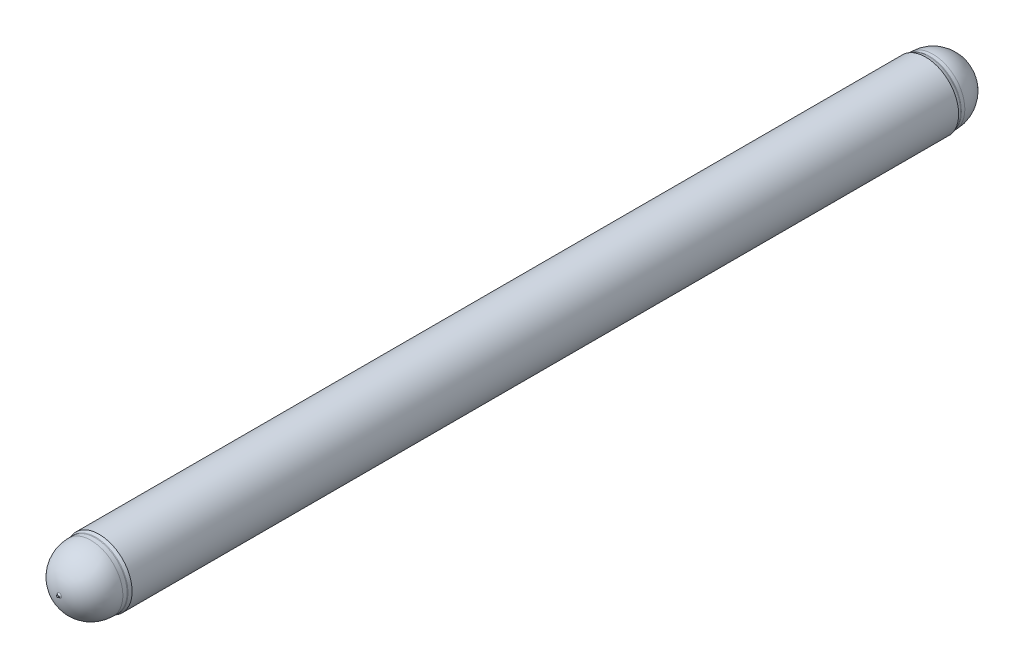
ISO-10303-21;
HEADER;
FILE_DESCRIPTION(('STEP AP214'),'2;1');
FILE_NAME('part.step','',(''),(''),'','','');
FILE_SCHEMA(('AUTOMOTIVE_DESIGN { 1 0 10303 214 1 1 1 1 }'));
ENDSEC;
DATA;
#1=APPLICATION_CONTEXT('core data for automotive mechanical design processes');
#2=APPLICATION_PROTOCOL_DEFINITION('international standard','automotive_design',2000,#1);
#3=PRODUCT_CONTEXT('',#1,'mechanical');
#4=PRODUCT('Part','Part','',(#3));
#5=PRODUCT_RELATED_PRODUCT_CATEGORY('part','',(#4));
#6=PRODUCT_DEFINITION_FORMATION('','',#4);
#7=PRODUCT_DEFINITION_CONTEXT('part definition',#1,'design');
#8=PRODUCT_DEFINITION('design','',#6,#7);
#9=PRODUCT_DEFINITION_SHAPE('','',#8);
#10=(LENGTH_UNIT() NAMED_UNIT(*) SI_UNIT(.MILLI.,.METRE.));
#11=(NAMED_UNIT(*) PLANE_ANGLE_UNIT() SI_UNIT($,.RADIAN.));
#12=(NAMED_UNIT(*) SI_UNIT($,.STERADIAN.) SOLID_ANGLE_UNIT());
#13=UNCERTAINTY_MEASURE_WITH_UNIT(LENGTH_MEASURE(1.E-05),#10,'distance_accuracy_value','');
#14=(GEOMETRIC_REPRESENTATION_CONTEXT(3) GLOBAL_UNCERTAINTY_ASSIGNED_CONTEXT((#13)) GLOBAL_UNIT_ASSIGNED_CONTEXT((#10,
#11,#12)) REPRESENTATION_CONTEXT('',''));
#15=CARTESIAN_POINT('',(0.,0.,0.));
#16=DIRECTION('',(0.,0.,1.));
#17=DIRECTION('',(1.,0.,0.));
#18=AXIS2_PLACEMENT_3D('',#15,#16,#17);
#19=CARTESIAN_POINT('',(0.,0.,0.));
#20=DIRECTION('',(0.,0.,1.));
#21=DIRECTION('',(1.,0.,0.));
#22=AXIS2_PLACEMENT_3D('',#19,#20,#21);
#23=PLANE('',#22);
#24=CARTESIAN_POINT('',(0.,0.,0.));
#25=DIRECTION('',(0.,0.,1.));
#26=DIRECTION('',(1.,0.,0.));
#27=AXIS2_PLACEMENT_3D('',#24,#25,#26);
#28=CIRCLE('',#27,9.315);
#29=CARTESIAN_POINT('',(9.315,0.,0.));
#30=VERTEX_POINT('',#29);
#31=EDGE_CURVE('E115',#30,#30,#28,.T.);
#32=ORIENTED_EDGE('',*,*,#31,.F.);
#33=EDGE_LOOP('',(#32));
#34=FACE_BOUND('',#33,.T.);
#35=ADVANCED_FACE('F35',(#34),#23,.F.);
#36=CARTESIAN_POINT('',(0.,30.9807621135333,-19.0685384575899));
#37=DIRECTION('',(0.,1.,0.));
#38=DIRECTION('',(0.,0.,1.));
#39=AXIS2_PLACEMENT_3D('',#36,#37,#38);
#40=PLANE('',#39);
#41=CARTESIAN_POINT('',(0.,30.9807621135333,70.4314615424101));
#42=DIRECTION('',(0.,1.,0.));
#43=DIRECTION('',(0.,0.,1.));
#44=AXIS2_PLACEMENT_3D('',#41,#42,#43);
#45=CIRCLE('',#44,61.0937179983725);
#46=CARTESIAN_POINT('',(-6.33279612804076,30.9807621135333,9.66684953784505));
#47=VERTEX_POINT('',#46);
#48=CARTESIAN_POINT('',(6.33279612803868,30.9807621135333,9.66684953784505));
#49=VERTEX_POINT('',#48);
#50=EDGE_CURVE('E61',#47,#49,#45,.F.);
#51=ORIENTED_EDGE('',*,*,#50,.T.);
#52=DIRECTION('',(1.,0.,0.));
#53=VECTOR('',#52,1.);
#54=CARTESIAN_POINT('',(-14.9999999999999,30.9807621135333,9.66684953784505));
#55=LINE('',#54,#53);
#56=EDGE_CURVE('E58',#47,#49,#55,.T.);
#57=ORIENTED_EDGE('',*,*,#56,.F.);
#58=EDGE_LOOP('',(#51,#57));
#59=FACE_BOUND('',#58,.T.);
#60=ADVANCED_FACE('F60',(#59),#40,.F.);
#61=CARTESIAN_POINT('',(15.,30.9807621135333,9.66684953784505));
#62=CARTESIAN_POINT('',(15.,25.9807621135333,4.97918885459588));
#63=CARTESIAN_POINT('',(5.00000000000002,30.9807621135333,9.66684953784505));
#64=CARTESIAN_POINT('',(5.12824397362627,25.9807621135333,2.71683287649438));
#65=CARTESIAN_POINT('',(-4.99999999999995,30.9807621135333,9.66684953784505));
#66=CARTESIAN_POINT('',(-5.12824397362621,25.9807621135333,2.71683287649437));
#67=CARTESIAN_POINT('',(-14.9999999999999,30.9807621135333,9.66684953784505));
#68=CARTESIAN_POINT('',(-14.9999999999999,25.9807621135333,4.97918885459586));
#69=B_SPLINE_SURFACE_WITH_KNOTS('',3,1,((#61,#62),(#63,#64),(#65,#66),(#67,#68)),.UNSPECIFIED.,
.F.,.F.,.F.,(4,4),(2,2),(0.,1.),(0.,1.),.UNSPECIFIED.);
#70=CARTESIAN_POINT('',(6.33279612804077,30.9807621135333,9.66684953784505));
#71=CARTESIAN_POINT('',(6.15466172563873,30.9544903369415,9.63489000613739));
#72=CARTESIAN_POINT('',(5.97604703848465,30.9296884599166,9.60445542969722));
#73=CARTESIAN_POINT('',(5.61798393782657,30.8828552011558,9.54656235464735));
#74=CARTESIAN_POINT('',(5.43853557206703,30.8608236627433,9.51910368774709));
#75=CARTESIAN_POINT('',(4.89920366308756,30.7986384001853,9.44109066840613));
#76=CARTESIAN_POINT('',(4.53823035787001,30.762379062676,9.39488093864832));
#77=CARTESIAN_POINT('',(3.81430161165798,30.6992051369334,9.31359532833977));
#78=CARTESIAN_POINT('',(3.45134648075895,30.6722891270351,9.27851775400861));
#79=CARTESIAN_POINT('',(2.72400148834174,30.6270339311728,9.21914036535696));
#80=CARTESIAN_POINT('',(2.35961152853409,30.6086953434667,9.19484130282191));
#81=CARTESIAN_POINT('',(1.63582572405396,30.5803215939309,9.15709973684184));
#82=CARTESIAN_POINT('',(1.27644355972998,30.5701579228712,9.14348929304422));
#83=CARTESIAN_POINT('',(0.557304131046213,30.5573800636836,9.12636111180757));
#84=CARTESIAN_POINT('',(0.197546865133548,30.554765906935,9.12284341631872));
#85=CARTESIAN_POINT('',(-0.521862695429466,30.5570188740302,9.1258693169772));
#86=CARTESIAN_POINT('',(-0.881514997109177,30.5618852189829,9.13241186562323));
#87=CARTESIAN_POINT('',(-1.60028516707872,30.5792233070497,9.15561364161088));
#88=CARTESIAN_POINT('',(-1.95940308332777,30.5916943205207,9.17227189838294));
#89=CARTESIAN_POINT('',(-2.54230990878947,30.6184167977461,9.20769312634523));
#90=CARTESIAN_POINT('',(-2.76640609289699,30.6302518326291,9.22333078702233));
#91=CARTESIAN_POINT('',(-3.21403384061042,30.6571515159125,9.25867659196171));
#92=CARTESIAN_POINT('',(-3.43756552385751,30.6722154094087,9.2783837847315));
#93=CARTESIAN_POINT('',(-3.88393308677477,30.7057298339231,9.32193873964612));
#94=CARTESIAN_POINT('',(-4.10676907803449,30.7241797900744,9.34578579891009));
#95=CARTESIAN_POINT('',(-4.55330168608233,30.7648198922771,9.39790827052252));
#96=CARTESIAN_POINT('',(-4.77699209993209,30.7870372229295,9.4262157550806));
#97=CARTESIAN_POINT('',(-5.2233946541349,30.8353607368104,9.48724101495475));
#98=CARTESIAN_POINT('',(-5.44610661010435,30.8614676231485,9.51995958755526));
#99=CARTESIAN_POINT('',(-5.89039158789609,30.9178857473944,9.58995406526875));
#100=CARTESIAN_POINT('',(-6.11196399060808,30.9481990624194,9.62723222080017));
#101=CARTESIAN_POINT('',(-6.33279612804076,30.9807621135333,9.66684953784505));
#102=B_SPLINE_CURVE_WITH_KNOTS('',3,(#70,#71,#72,#73,#74,#75,#76,#77,#78,#79,#80,#81,#82,#83,
#84,#85,#86,#87,#88,#89,#90,#91,#92,#93,#94,#95,#96,#97,#98,#99,#100,#101),.UNSPECIFIED.,.F.,
.F.,(4,2,2,2,2,2,2,2,2,2,2,2,2,2,2,4),(0.,0.548596833442432,1.09716262700047,2.19397757556172,
3.29062556136727,4.38735002474257,5.46647727616043,6.54560901292967,7.62462839503449,
8.70354426506496,9.37834915104849,10.0529964399794,10.7275292967854,11.4071544598024,
12.0869026271256,12.7669876537213),.UNSPECIFIED.);
#103=EDGE_CURVE('E53',#49,#47,#102,.T.);
#104=ORIENTED_EDGE('',*,*,#103,.T.);
#105=ORIENTED_EDGE('',*,*,#56,.T.);
#106=EDGE_LOOP('',(#104,#105));
#107=FACE_BOUND('',#106,.T.);
#108=ADVANCED_FACE('F70',(#107),#69,.F.);
#109=CARTESIAN_POINT('',(0.,0.,70.4314615424101));
#110=DIRECTION('',(0.,0.,1.));
#111=DIRECTION('',(-1.,0.,0.));
#112=AXIS2_PLACEMENT_3D('',#109,#110,#111);
#113=SPHERICAL_SURFACE('',#112,68.5);
#114=CARTESIAN_POINT('',(0.,0.,2.95516621856271));
#115=DIRECTION('',(0.,0.,1.));
#116=DIRECTION('',(1.,0.,0.));
#117=AXIS2_PLACEMENT_3D('',#114,#115,#116);
#118=CIRCLE('',#117,11.7982867132867);
#119=CARTESIAN_POINT('',(11.7982867132867,0.,2.95516621856271));
#120=VERTEX_POINT('',#119);
#121=EDGE_CURVE('E64',#120,#120,#118,.F.);
#122=ORIENTED_EDGE('',*,*,#121,.F.);
#123=EDGE_LOOP('',(#122));
#124=FACE_BOUND('',#123,.T.);
#125=ORIENTED_EDGE('',*,*,#103,.F.);
#126=ORIENTED_EDGE('',*,*,#50,.F.);
#127=EDGE_LOOP('',(#125,#126));
#128=FACE_BOUND('',#127,.T.);
#129=CARTESIAN_POINT('',(0.,0.,70.4314615424101));
#130=DIRECTION('',(0.,0.,1.));
#131=DIRECTION('',(1.,0.,0.));
#132=AXIS2_PLACEMENT_3D('',#129,#130,#131);
#133=CIRCLE('',#132,68.5);
#134=CARTESIAN_POINT('',(68.5,0.,70.4314615424101));
#135=VERTEX_POINT('',#134);
#136=EDGE_CURVE('E119',#135,#135,#133,.T.);
#137=ORIENTED_EDGE('',*,*,#136,.F.);
#138=EDGE_LOOP('',(#137));
#139=FACE_BOUND('',#138,.T.);
#140=ADVANCED_FACE('F67',(#124,#128,#139),#113,.T.);
#141=CARTESIAN_POINT('',(0.,0.,0.));
#142=DIRECTION('',(0.,0.,1.));
#143=DIRECTION('',(1.,0.,0.));
#144=AXIS2_PLACEMENT_3D('',#141,#142,#143);
#145=TOROIDAL_SURFACE('',#144,12.315,3.);
#146=ORIENTED_EDGE('',*,*,#121,.T.);
#147=EDGE_LOOP('',(#146));
#148=FACE_BOUND('',#147,.T.);
#149=ORIENTED_EDGE('',*,*,#31,.T.);
#150=EDGE_LOOP('',(#149));
#151=FACE_BOUND('',#150,.T.);
#152=ADVANCED_FACE('F149',(#148,#151),#145,.F.);
#153=CARTESIAN_POINT('',(0.,0.,70.4314615424101));
#154=DIRECTION('',(0.,0.,1.));
#155=DIRECTION('',(1.,0.,0.));
#156=AXIS2_PLACEMENT_3D('',#153,#154,#155);
#157=CYLINDRICAL_SURFACE('',#156,68.5);
#158=ORIENTED_EDGE('',*,*,#136,.T.);
#159=EDGE_LOOP('',(#158));
#160=FACE_BOUND('',#159,.T.);
#161=CARTESIAN_POINT('',(0.,0.,77.8700732415682));
#162=DIRECTION('',(0.,0.,1.));
#163=DIRECTION('',(1.,0.,0.));
#164=AXIS2_PLACEMENT_3D('',#161,#162,#163);
#165=CIRCLE('',#164,68.5);
#166=CARTESIAN_POINT('',(68.5,0.,77.8700732415682));
#167=VERTEX_POINT('',#166);
#168=EDGE_CURVE('E122',#167,#167,#165,.T.);
#169=ORIENTED_EDGE('',*,*,#168,.F.);
#170=EDGE_LOOP('',(#169));
#171=FACE_BOUND('',#170,.T.);
#172=ADVANCED_FACE('F151',(#160,#171),#157,.T.);
#173=CARTESIAN_POINT('',(0.,0.,77.8700732415682));
#174=DIRECTION('',(0.,0.,1.));
#175=DIRECTION('',(1.,0.,0.));
#176=AXIS2_PLACEMENT_3D('',#173,#174,#175);
#177=TOROIDAL_SURFACE('',#176,73.5,5.);
#178=ORIENTED_EDGE('',*,*,#168,.T.);
#179=EDGE_LOOP('',(#178));
#180=FACE_BOUND('',#179,.T.);
#181=CARTESIAN_POINT('',(0.,0.,79.4512120716524));
#182=DIRECTION('',(0.,0.,1.));
#183=DIRECTION('',(1.,0.,0.));
#184=AXIS2_PLACEMENT_3D('',#181,#182,#183);
#185=CIRCLE('',#184,68.7565835097474);
#186=CARTESIAN_POINT('',(68.7565835097474,0.,79.4512120716524));
#187=VERTEX_POINT('',#186);
#188=EDGE_CURVE('E124',#187,#187,#185,.T.);
#189=ORIENTED_EDGE('',*,*,#188,.F.);
#190=EDGE_LOOP('',(#189));
#191=FACE_BOUND('',#190,.T.);
#192=ADVANCED_FACE('F156',(#180,#191),#177,.F.);
#193=CARTESIAN_POINT('',(0.,0.,86.1814615424101));
#194=DIRECTION('',(0.,0.,1.));
#195=DIRECTION('',(1.,0.,0.));
#196=AXIS2_PLACEMENT_3D('',#193,#194,#195);
#197=CONICAL_SURFACE('',#196,71.,0.321750554396642);
#198=ORIENTED_EDGE('',*,*,#188,.T.);
#199=EDGE_LOOP('',(#198));
#200=FACE_BOUND('',#199,.T.);
#201=CARTESIAN_POINT('',(0.,0.,86.1814615424101));
#202=DIRECTION('',(0.,0.,1.));
#203=DIRECTION('',(1.,0.,0.));
#204=AXIS2_PLACEMENT_3D('',#201,#202,#203);
#205=CIRCLE('',#204,71.);
#206=CARTESIAN_POINT('',(71.,0.,86.1814615424101));
#207=VERTEX_POINT('',#206);
#208=EDGE_CURVE('E80',#207,#207,#205,.T.);
#209=ORIENTED_EDGE('',*,*,#208,.F.);
#210=EDGE_LOOP('',(#209));
#211=FACE_BOUND('',#210,.T.);
#212=ADVANCED_FACE('F91',(#200,#211),#197,.T.);
#213=CARTESIAN_POINT('',(0.,0.,2154.87256400107));
#214=DIRECTION('',(0.,0.,-1.));
#215=DIRECTION('',(-1.,0.,0.));
#216=AXIS2_PLACEMENT_3D('',#213,#214,#215);
#217=CYLINDRICAL_SURFACE('',#216,71.);
#218=ORIENTED_EDGE('',*,*,#208,.T.);
#219=EDGE_LOOP('',(#218));
#220=FACE_BOUND('',#219,.T.);
#221=CARTESIAN_POINT('',(0.,0.,1864.55423814409));
#222=DIRECTION('',(0.,0.,-1.));
#223=DIRECTION('',(-1.,0.,0.));
#224=AXIS2_PLACEMENT_3D('',#221,#222,#223);
#225=CIRCLE('',#224,71.);
#226=CARTESIAN_POINT('',(-71.,0.,1864.55423814409));
#227=VERTEX_POINT('',#226);
#228=EDGE_CURVE('E129',#227,#227,#225,.T.);
#229=ORIENTED_EDGE('',*,*,#228,.T.);
#230=EDGE_LOOP('',(#229));
#231=FACE_BOUND('',#230,.T.);
#232=ADVANCED_FACE('F37',(#220,#231),#217,.T.);
#233=CARTESIAN_POINT('',(0.,0.,1882.05423814409));
#234=DIRECTION('',(0.,0.,-1.));
#235=DIRECTION('',(1.,0.,0.));
#236=AXIS2_PLACEMENT_3D('',#233,#234,#235);
#237=SPHERICAL_SURFACE('',#236,68.5);
#238=CARTESIAN_POINT('',(0.,0.,1950.37458323612));
#239=DIRECTION('',(0.,0.,-1.));
#240=DIRECTION('',(-1.,0.,0.));
#241=AXIS2_PLACEMENT_3D('',#238,#239,#240);
#242=CIRCLE('',#241,4.95786713286713);
#243=CARTESIAN_POINT('',(-4.95786713286713,0.,1950.37458323612));
#244=VERTEX_POINT('',#243);
#245=EDGE_CURVE('E138',#244,#244,#242,.F.);
#246=ORIENTED_EDGE('',*,*,#245,.F.);
#247=EDGE_LOOP('',(#246));
#248=FACE_BOUND('',#247,.T.);
#249=CARTESIAN_POINT('',(0.,0.,1882.05423814409));
#250=DIRECTION('',(0.,0.,-1.));
#251=DIRECTION('',(-1.,0.,0.));
#252=AXIS2_PLACEMENT_3D('',#249,#250,#251);
#253=CIRCLE('',#252,68.5);
#254=CARTESIAN_POINT('',(-68.5,0.,1882.05423814409));
#255=VERTEX_POINT('',#254);
#256=EDGE_CURVE('E141',#255,#255,#253,.T.);
#257=ORIENTED_EDGE('',*,*,#256,.F.);
#258=EDGE_LOOP('',(#257));
#259=FACE_BOUND('',#258,.T.);
#260=ADVANCED_FACE('F166',(#248,#259),#237,.T.);
#261=CARTESIAN_POINT('',(0.,0.,1953.36671513796));
#262=DIRECTION('',(0.,0.,-1.));
#263=DIRECTION('',(-1.,0.,0.));
#264=AXIS2_PLACEMENT_3D('',#261,#262,#263);
#265=TOROIDAL_SURFACE('',#264,5.175,3.);
#266=CARTESIAN_POINT('',(0.,0.,1953.36671513796));
#267=DIRECTION('',(0.,0.,-1.));
#268=DIRECTION('',(-1.,0.,0.));
#269=AXIS2_PLACEMENT_3D('',#266,#267,#268);
#270=CIRCLE('',#269,2.175);
#271=CARTESIAN_POINT('',(-2.175,0.,1953.36671513796));
#272=VERTEX_POINT('',#271);
#273=EDGE_CURVE('E133',#272,#272,#270,.T.);
#274=ORIENTED_EDGE('',*,*,#273,.T.);
#275=EDGE_LOOP('',(#274));
#276=FACE_BOUND('',#275,.T.);
#277=ORIENTED_EDGE('',*,*,#245,.T.);
#278=EDGE_LOOP('',(#277));
#279=FACE_BOUND('',#278,.T.);
#280=ADVANCED_FACE('F164',(#276,#279),#265,.F.);
#281=CARTESIAN_POINT('',(0.,0.,1954.05523814409));
#282=DIRECTION('',(0.,0.,-1.));
#283=DIRECTION('',(-1.,0.,0.));
#284=AXIS2_PLACEMENT_3D('',#281,#282,#283);
#285=CYLINDRICAL_SURFACE('',#284,2.175);
#286=ORIENTED_EDGE('',*,*,#273,.F.);
#287=EDGE_LOOP('',(#286));
#288=FACE_BOUND('',#287,.T.);
#289=CARTESIAN_POINT('',(0.,0.,1954.05423814409));
#290=DIRECTION('',(0.,0.,-1.));
#291=DIRECTION('',(-1.,0.,0.));
#292=AXIS2_PLACEMENT_3D('',#289,#290,#291);
#293=CIRCLE('',#292,2.175);
#294=CARTESIAN_POINT('',(-2.175,0.,1954.05423814409));
#295=VERTEX_POINT('',#294);
#296=EDGE_CURVE('E11',#295,#295,#293,.F.);
#297=ORIENTED_EDGE('',*,*,#296,.F.);
#298=EDGE_LOOP('',(#297));
#299=FACE_BOUND('',#298,.T.);
#300=ADVANCED_FACE('F160',(#288,#299),#285,.T.);
#301=CARTESIAN_POINT('',(0.,0.,1882.05423814409));
#302=DIRECTION('',(0.,0.,-1.));
#303=DIRECTION('',(-1.,0.,0.));
#304=AXIS2_PLACEMENT_3D('',#301,#302,#303);
#305=CYLINDRICAL_SURFACE('',#304,68.5);
#306=ORIENTED_EDGE('',*,*,#256,.T.);
#307=EDGE_LOOP('',(#306));
#308=FACE_BOUND('',#307,.T.);
#309=CARTESIAN_POINT('',(0.,0.,1872.86562644494));
#310=DIRECTION('',(0.,0.,-1.));
#311=DIRECTION('',(-1.,0.,0.));
#312=AXIS2_PLACEMENT_3D('',#309,#310,#311);
#313=CIRCLE('',#312,68.5);
#314=CARTESIAN_POINT('',(-68.5,0.,1872.86562644494));
#315=VERTEX_POINT('',#314);
#316=EDGE_CURVE('E191',#315,#315,#313,.T.);
#317=ORIENTED_EDGE('',*,*,#316,.F.);
#318=EDGE_LOOP('',(#317));
#319=FACE_BOUND('',#318,.T.);
#320=ADVANCED_FACE('F163',(#308,#319),#305,.T.);
#321=CARTESIAN_POINT('',(0.,0.,1872.86562644494));
#322=DIRECTION('',(0.,0.,-1.));
#323=DIRECTION('',(-1.,0.,0.));
#324=AXIS2_PLACEMENT_3D('',#321,#322,#323);
#325=TOROIDAL_SURFACE('',#324,73.5,5.00000000000001);
#326=ORIENTED_EDGE('',*,*,#316,.T.);
#327=EDGE_LOOP('',(#326));
#328=FACE_BOUND('',#327,.T.);
#329=CARTESIAN_POINT('',(0.,0.,1871.28448761485));
#330=DIRECTION('',(0.,0.,-1.));
#331=DIRECTION('',(-1.,0.,0.));
#332=AXIS2_PLACEMENT_3D('',#329,#330,#331);
#333=CIRCLE('',#332,68.7565835097474);
#334=CARTESIAN_POINT('',(-68.7565835097474,0.,1871.28448761485));
#335=VERTEX_POINT('',#334);
#336=EDGE_CURVE('E46',#335,#335,#333,.T.);
#337=ORIENTED_EDGE('',*,*,#336,.F.);
#338=EDGE_LOOP('',(#337));
#339=FACE_BOUND('',#338,.T.);
#340=ADVANCED_FACE('F172',(#328,#339),#325,.F.);
#341=CARTESIAN_POINT('',(0.,0.,1864.55423814409));
#342=DIRECTION('',(0.,0.,-1.));
#343=DIRECTION('',(-1.,0.,0.));
#344=AXIS2_PLACEMENT_3D('',#341,#342,#343);
#345=CONICAL_SURFACE('',#344,71.,0.321750554396642);
#346=ORIENTED_EDGE('',*,*,#336,.T.);
#347=EDGE_LOOP('',(#346));
#348=FACE_BOUND('',#347,.T.);
#349=ORIENTED_EDGE('',*,*,#228,.F.);
#350=EDGE_LOOP('',(#349));
#351=FACE_BOUND('',#350,.T.);
#352=ADVANCED_FACE('F176',(#348,#351),#345,.T.);
#353=CARTESIAN_POINT('',(25.,0.,1954.05423814409));
#354=DIRECTION('',(0.,0.,-1.));
#355=DIRECTION('',(-1.,0.,0.));
#356=AXIS2_PLACEMENT_3D('',#353,#354,#355);
#357=PLANE('',#356);
#358=ORIENTED_EDGE('',*,*,#296,.T.);
#359=EDGE_LOOP('',(#358));
#360=FACE_BOUND('',#359,.T.);
#361=ADVANCED_FACE('F104',(#360),#357,.F.);
#362=CLOSED_SHELL('',(#35,#60,#108,#140,#152,#172,#192,#212,#232,#260,#280,#300,#320,#340,#352,#361));
#363=MANIFOLD_SOLID_BREP('B2',#362);
#364=ADVANCED_BREP_SHAPE_REPRESENTATION('',(#18,#363),#14);
#365=SHAPE_DEFINITION_REPRESENTATION(#9,#364);
ENDSEC;
END-ISO-10303-21;
